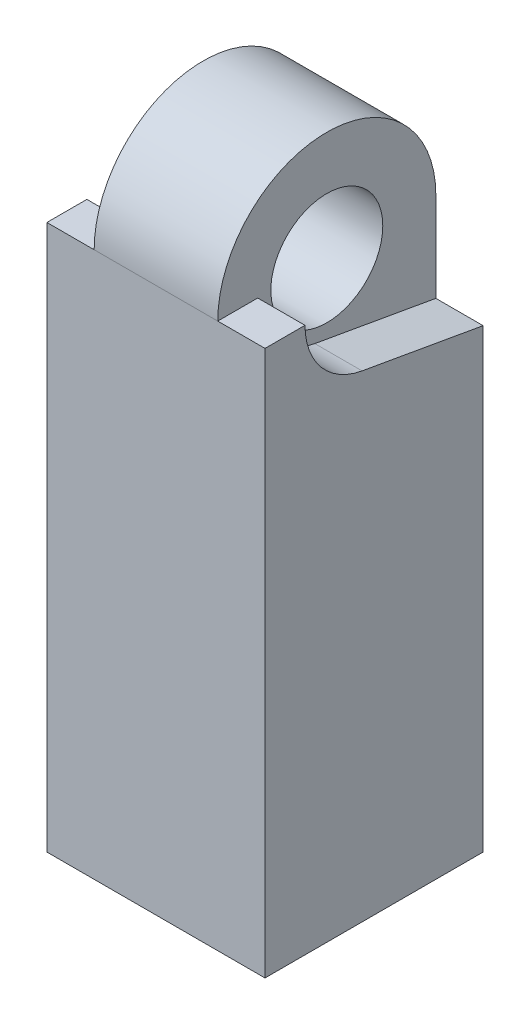
ISO-10303-21;
HEADER;
FILE_DESCRIPTION(('STEP AP214'),'2;1');
FILE_NAME('part.step','',(''),(''),'','','');
FILE_SCHEMA(('AUTOMOTIVE_DESIGN { 1 0 10303 214 1 1 1 1 }'));
ENDSEC;
DATA;
#1=APPLICATION_CONTEXT('core data for automotive mechanical design processes');
#2=APPLICATION_PROTOCOL_DEFINITION('international standard','automotive_design',2000,#1);
#3=PRODUCT_CONTEXT('',#1,'mechanical');
#4=PRODUCT('Part','Part','',(#3));
#5=PRODUCT_RELATED_PRODUCT_CATEGORY('part','',(#4));
#6=PRODUCT_DEFINITION_FORMATION('','',#4);
#7=PRODUCT_DEFINITION_CONTEXT('part definition',#1,'design');
#8=PRODUCT_DEFINITION('design','',#6,#7);
#9=PRODUCT_DEFINITION_SHAPE('','',#8);
#10=(LENGTH_UNIT() NAMED_UNIT(*) SI_UNIT(.MILLI.,.METRE.));
#11=(NAMED_UNIT(*) PLANE_ANGLE_UNIT() SI_UNIT($,.RADIAN.));
#12=(NAMED_UNIT(*) SI_UNIT($,.STERADIAN.) SOLID_ANGLE_UNIT());
#13=UNCERTAINTY_MEASURE_WITH_UNIT(LENGTH_MEASURE(1.E-05),#10,'distance_accuracy_value','');
#14=(GEOMETRIC_REPRESENTATION_CONTEXT(3) GLOBAL_UNCERTAINTY_ASSIGNED_CONTEXT((#13)) GLOBAL_UNIT_ASSIGNED_CONTEXT((#10,
#11,#12)) REPRESENTATION_CONTEXT('',''));
#15=CARTESIAN_POINT('',(0.,0.,0.));
#16=DIRECTION('',(0.,0.,1.));
#17=DIRECTION('',(1.,0.,0.));
#18=AXIS2_PLACEMENT_3D('',#15,#16,#17);
#19=CARTESIAN_POINT('',(-8.5,0.,0.));
#20=DIRECTION('',(1.,0.,0.));
#21=DIRECTION('',(0.,0.,-1.));
#22=AXIS2_PLACEMENT_3D('',#19,#20,#21);
#23=PLANE('',#22);
#24=CARTESIAN_POINT('',(-8.5,0.,0.));
#25=DIRECTION('',(1.,0.,0.));
#26=DIRECTION('',(0.,0.,-1.));
#27=AXIS2_PLACEMENT_3D('',#24,#25,#26);
#28=CIRCLE('',#27,7.7);
#29=CARTESIAN_POINT('',(-8.5,0.,-7.7));
#30=VERTEX_POINT('',#29);
#31=EDGE_CURVE('E195',#30,#30,#28,.T.);
#32=ORIENTED_EDGE('',*,*,#31,.T.);
#33=EDGE_LOOP('',(#32));
#34=FACE_BOUND('',#33,.T.);
#35=DIRECTION('',(0.,0.173648177666926,0.984807753012209));
#36=VECTOR('',#35,1.);
#37=CARTESIAN_POINT('',(-8.5,-9.35567365361599,1.6496576878358));
#38=LINE('',#37,#36);
#39=CARTESIAN_POINT('',(-8.5,-12.2914575235415,-15.));
#40=VERTEX_POINT('',#39);
#41=CARTESIAN_POINT('',(-8.5,-9.35567365361599,1.6496576878358));
#42=VERTEX_POINT('',#41);
#43=EDGE_CURVE('E200',#40,#42,#38,.T.);
#44=ORIENTED_EDGE('',*,*,#43,.T.);
#45=CARTESIAN_POINT('',(-8.5,0.,0.));
#46=DIRECTION('',(1.,0.,0.));
#47=DIRECTION('',(0.,0.,-1.));
#48=AXIS2_PLACEMENT_3D('',#45,#46,#47);
#49=CIRCLE('',#48,9.50000000000001);
#50=CARTESIAN_POINT('',(-8.5,0.,9.5));
#51=VERTEX_POINT('',#50);
#52=EDGE_CURVE('E191',#51,#42,#49,.T.);
#53=ORIENTED_EDGE('',*,*,#52,.F.);
#54=DIRECTION('',(0.,0.,-1.));
#55=VECTOR('',#54,1.);
#56=CARTESIAN_POINT('',(-8.5,0.,0.));
#57=LINE('',#56,#55);
#58=CARTESIAN_POINT('',(-8.5,0.,15.));
#59=VERTEX_POINT('',#58);
#60=EDGE_CURVE('E136',#59,#51,#57,.T.);
#61=ORIENTED_EDGE('',*,*,#60,.F.);
#62=CARTESIAN_POINT('',(-8.5,0.,0.));
#63=DIRECTION('',(1.,0.,0.));
#64=DIRECTION('',(0.,0.,-1.));
#65=AXIS2_PLACEMENT_3D('',#62,#63,#64);
#66=CIRCLE('',#65,15.);
#67=CARTESIAN_POINT('',(-8.5,0.,-15.));
#68=VERTEX_POINT('',#67);
#69=EDGE_CURVE('E198',#68,#59,#66,.T.);
#70=ORIENTED_EDGE('',*,*,#69,.F.);
#71=DIRECTION('',(0.,-1.,0.));
#72=VECTOR('',#71,1.);
#73=CARTESIAN_POINT('',(-8.5,0.,-15.));
#74=LINE('',#73,#72);
#75=EDGE_CURVE('E202',#68,#40,#74,.T.);
#76=ORIENTED_EDGE('',*,*,#75,.T.);
#77=EDGE_LOOP('',(#44,#53,#61,#70,#76));
#78=FACE_BOUND('',#77,.T.);
#79=ADVANCED_FACE('F41',(#34,#78),#23,.F.);
#80=CARTESIAN_POINT('',(8.5,0.,0.));
#81=DIRECTION('',(1.,0.,0.));
#82=DIRECTION('',(0.,0.,-1.));
#83=AXIS2_PLACEMENT_3D('',#80,#81,#82);
#84=PLANE('',#83);
#85=CARTESIAN_POINT('',(8.5,0.,0.));
#86=DIRECTION('',(1.,0.,0.));
#87=DIRECTION('',(0.,0.,-1.));
#88=AXIS2_PLACEMENT_3D('',#85,#86,#87);
#89=CIRCLE('',#88,7.7);
#90=CARTESIAN_POINT('',(8.5,0.,-7.7));
#91=VERTEX_POINT('',#90);
#92=EDGE_CURVE('E194',#91,#91,#89,.T.);
#93=ORIENTED_EDGE('',*,*,#92,.F.);
#94=EDGE_LOOP('',(#93));
#95=FACE_BOUND('',#94,.T.);
#96=CARTESIAN_POINT('',(8.5,0.,0.));
#97=DIRECTION('',(1.,0.,0.));
#98=DIRECTION('',(0.,0.,-1.));
#99=AXIS2_PLACEMENT_3D('',#96,#97,#98);
#100=CIRCLE('',#99,9.50000000000001);
#101=CARTESIAN_POINT('',(8.5,0.,9.5));
#102=VERTEX_POINT('',#101);
#103=CARTESIAN_POINT('',(8.5,-9.35567365361599,1.6496576878358));
#104=VERTEX_POINT('',#103);
#105=EDGE_CURVE('E11',#102,#104,#100,.T.);
#106=ORIENTED_EDGE('',*,*,#105,.T.);
#107=DIRECTION('',(0.,0.173648177666926,0.984807753012209));
#108=VECTOR('',#107,1.);
#109=CARTESIAN_POINT('',(8.5,-9.35567365361599,1.6496576878358));
#110=LINE('',#109,#108);
#111=CARTESIAN_POINT('',(8.5,-12.2914575235415,-15.));
#112=VERTEX_POINT('',#111);
#113=EDGE_CURVE('E210',#112,#104,#110,.T.);
#114=ORIENTED_EDGE('',*,*,#113,.F.);
#115=DIRECTION('',(0.,-1.,0.));
#116=VECTOR('',#115,1.);
#117=CARTESIAN_POINT('',(8.5,0.,-15.));
#118=LINE('',#117,#116);
#119=CARTESIAN_POINT('',(8.5,0.,-15.));
#120=VERTEX_POINT('',#119);
#121=EDGE_CURVE('E133',#120,#112,#118,.T.);
#122=ORIENTED_EDGE('',*,*,#121,.F.);
#123=CARTESIAN_POINT('',(8.5,0.,0.));
#124=DIRECTION('',(1.,0.,0.));
#125=DIRECTION('',(0.,0.,-1.));
#126=AXIS2_PLACEMENT_3D('',#123,#124,#125);
#127=CIRCLE('',#126,15.);
#128=CARTESIAN_POINT('',(8.5,0.,15.));
#129=VERTEX_POINT('',#128);
#130=EDGE_CURVE('E207',#120,#129,#127,.T.);
#131=ORIENTED_EDGE('',*,*,#130,.T.);
#132=DIRECTION('',(0.,0.,-1.));
#133=VECTOR('',#132,1.);
#134=CARTESIAN_POINT('',(8.5,0.,0.));
#135=LINE('',#134,#133);
#136=EDGE_CURVE('E49',#129,#102,#135,.T.);
#137=ORIENTED_EDGE('',*,*,#136,.T.);
#138=EDGE_LOOP('',(#106,#114,#122,#131,#137));
#139=FACE_BOUND('',#138,.T.);
#140=ADVANCED_FACE('F215',(#95,#139),#84,.T.);
#141=CARTESIAN_POINT('',(-8.5,0.,0.));
#142=DIRECTION('',(1.,0.,0.));
#143=DIRECTION('',(0.,0.,-1.));
#144=AXIS2_PLACEMENT_3D('',#141,#142,#143);
#145=CYLINDRICAL_SURFACE('',#144,15.);
#146=DIRECTION('',(-1.,0.,0.));
#147=VECTOR('',#146,1.);
#148=CARTESIAN_POINT('',(15.,0.,15.));
#149=LINE('',#148,#147);
#150=EDGE_CURVE('E186',#129,#59,#149,.T.);
#151=ORIENTED_EDGE('',*,*,#150,.F.);
#152=ORIENTED_EDGE('',*,*,#130,.F.);
#153=DIRECTION('',(1.,0.,0.));
#154=VECTOR('',#153,1.);
#155=CARTESIAN_POINT('',(-8.5,0.,-15.));
#156=LINE('',#155,#154);
#157=EDGE_CURVE('E65',#68,#120,#156,.T.);
#158=ORIENTED_EDGE('',*,*,#157,.F.);
#159=ORIENTED_EDGE('',*,*,#69,.T.);
#160=EDGE_LOOP('',(#151,#152,#158,#159));
#161=FACE_BOUND('',#160,.T.);
#162=ADVANCED_FACE('F225',(#161),#145,.T.);
#163=CARTESIAN_POINT('',(-8.5,0.,-15.));
#164=DIRECTION('',(0.,0.,1.));
#165=DIRECTION('',(0.,-1.,0.));
#166=AXIS2_PLACEMENT_3D('',#163,#164,#165);
#167=PLANE('',#166);
#168=ORIENTED_EDGE('',*,*,#121,.T.);
#169=DIRECTION('',(-1.,0.,0.));
#170=VECTOR('',#169,1.);
#171=CARTESIAN_POINT('',(15.,-12.2914575235415,-15.));
#172=LINE('',#171,#170);
#173=CARTESIAN_POINT('',(15.,-12.2914575235415,-15.));
#174=VERTEX_POINT('',#173);
#175=EDGE_CURVE('E126',#174,#112,#172,.T.);
#176=ORIENTED_EDGE('',*,*,#175,.F.);
#177=DIRECTION('',(0.,-1.,0.));
#178=VECTOR('',#177,1.);
#179=CARTESIAN_POINT('',(15.,0.,-15.));
#180=LINE('',#179,#178);
#181=CARTESIAN_POINT('',(15.,-75.,-15.));
#182=VERTEX_POINT('',#181);
#183=EDGE_CURVE('E130',#174,#182,#180,.T.);
#184=ORIENTED_EDGE('',*,*,#183,.T.);
#185=DIRECTION('',(-1.,0.,0.));
#186=VECTOR('',#185,1.);
#187=CARTESIAN_POINT('',(15.,-75.,-15.));
#188=LINE('',#187,#186);
#189=CARTESIAN_POINT('',(-15.,-75.,-15.));
#190=VERTEX_POINT('',#189);
#191=EDGE_CURVE('E163',#182,#190,#188,.T.);
#192=ORIENTED_EDGE('',*,*,#191,.T.);
#193=DIRECTION('',(0.,-1.,0.));
#194=VECTOR('',#193,1.);
#195=CARTESIAN_POINT('',(-15.,0.,-15.));
#196=LINE('',#195,#194);
#197=CARTESIAN_POINT('',(-15.,-12.2914575235415,-15.));
#198=VERTEX_POINT('',#197);
#199=EDGE_CURVE('E164',#198,#190,#196,.T.);
#200=ORIENTED_EDGE('',*,*,#199,.F.);
#201=EDGE_CURVE('E137',#40,#198,#172,.T.);
#202=ORIENTED_EDGE('',*,*,#201,.F.);
#203=ORIENTED_EDGE('',*,*,#75,.F.);
#204=ORIENTED_EDGE('',*,*,#157,.T.);
#205=EDGE_LOOP('',(#168,#176,#184,#192,#200,#202,#203,#204));
#206=FACE_BOUND('',#205,.T.);
#207=ADVANCED_FACE('F128',(#206),#167,.F.);
#208=CARTESIAN_POINT('',(-8.5,0.,0.));
#209=DIRECTION('',(1.,0.,0.));
#210=DIRECTION('',(0.,0.,-1.));
#211=AXIS2_PLACEMENT_3D('',#208,#209,#210);
#212=CYLINDRICAL_SURFACE('',#211,7.7);
#213=ORIENTED_EDGE('',*,*,#31,.F.);
#214=EDGE_LOOP('',(#213));
#215=FACE_BOUND('',#214,.T.);
#216=ORIENTED_EDGE('',*,*,#92,.T.);
#217=EDGE_LOOP('',(#216));
#218=FACE_BOUND('',#217,.T.);
#219=ADVANCED_FACE('F43',(#215,#218),#212,.F.);
#220=CARTESIAN_POINT('',(15.,-9.35567365361599,1.6496576878358));
#221=DIRECTION('',(0.,-0.984807753012209,0.173648177666926));
#222=DIRECTION('',(0.,-0.173648177666926,-0.984807753012209));
#223=AXIS2_PLACEMENT_3D('',#220,#221,#222);
#224=PLANE('',#223);
#225=DIRECTION('',(-1.,0.,0.));
#226=VECTOR('',#225,1.);
#227=CARTESIAN_POINT('',(15.,-9.35567365361599,1.6496576878358));
#228=LINE('',#227,#226);
#229=CARTESIAN_POINT('',(-15.,-9.35567365361599,1.6496576878358));
#230=VERTEX_POINT('',#229);
#231=EDGE_CURVE('E188',#42,#230,#228,.T.);
#232=ORIENTED_EDGE('',*,*,#231,.F.);
#233=ORIENTED_EDGE('',*,*,#43,.F.);
#234=ORIENTED_EDGE('',*,*,#201,.T.);
#235=DIRECTION('',(0.,0.173648177666926,0.984807753012209));
#236=VECTOR('',#235,1.);
#237=CARTESIAN_POINT('',(-15.,-9.35567365361599,1.6496576878358));
#238=LINE('',#237,#236);
#239=EDGE_CURVE('E167',#198,#230,#238,.T.);
#240=ORIENTED_EDGE('',*,*,#239,.T.);
#241=EDGE_LOOP('',(#232,#233,#234,#240));
#242=FACE_BOUND('',#241,.T.);
#243=ADVANCED_FACE('F247',(#242),#224,.F.);
#244=CARTESIAN_POINT('',(15.,0.,0.));
#245=DIRECTION('',(-1.,0.,0.));
#246=DIRECTION('',(0.,0.,1.));
#247=AXIS2_PLACEMENT_3D('',#244,#245,#246);
#248=CYLINDRICAL_SURFACE('',#247,9.50000000000001);
#249=DIRECTION('',(-1.,0.,0.));
#250=VECTOR('',#249,1.);
#251=CARTESIAN_POINT('',(15.,0.,9.5));
#252=LINE('',#251,#250);
#253=CARTESIAN_POINT('',(-15.,0.,9.5));
#254=VERTEX_POINT('',#253);
#255=EDGE_CURVE('E185',#51,#254,#252,.T.);
#256=ORIENTED_EDGE('',*,*,#255,.F.);
#257=ORIENTED_EDGE('',*,*,#52,.T.);
#258=ORIENTED_EDGE('',*,*,#231,.T.);
#259=CARTESIAN_POINT('',(-15.,0.,0.));
#260=DIRECTION('',(1.,0.,0.));
#261=DIRECTION('',(0.,0.,-1.));
#262=AXIS2_PLACEMENT_3D('',#259,#260,#261);
#263=CIRCLE('',#262,9.50000000000001);
#264=EDGE_CURVE('E170',#230,#254,#263,.F.);
#265=ORIENTED_EDGE('',*,*,#264,.T.);
#266=EDGE_LOOP('',(#256,#257,#258,#265));
#267=FACE_BOUND('',#266,.T.);
#268=ADVANCED_FACE('F245',(#267),#248,.F.);
#269=CARTESIAN_POINT('',(15.,0.,0.));
#270=DIRECTION('',(0.,-1.,0.));
#271=DIRECTION('',(0.,0.,-1.));
#272=AXIS2_PLACEMENT_3D('',#269,#270,#271);
#273=PLANE('',#272);
#274=CARTESIAN_POINT('',(-15.,0.,15.));
#275=VERTEX_POINT('',#274);
#276=EDGE_CURVE('E181',#59,#275,#149,.T.);
#277=ORIENTED_EDGE('',*,*,#276,.F.);
#278=ORIENTED_EDGE('',*,*,#60,.T.);
#279=ORIENTED_EDGE('',*,*,#255,.T.);
#280=DIRECTION('',(0.,0.,1.));
#281=VECTOR('',#280,1.);
#282=CARTESIAN_POINT('',(-15.,0.,0.));
#283=LINE('',#282,#281);
#284=EDGE_CURVE('E173',#254,#275,#283,.T.);
#285=ORIENTED_EDGE('',*,*,#284,.T.);
#286=EDGE_LOOP('',(#277,#278,#279,#285));
#287=FACE_BOUND('',#286,.T.);
#288=ADVANCED_FACE('F230',(#287),#273,.F.);
#289=ORIENTED_EDGE('',*,*,#113,.T.);
#290=CARTESIAN_POINT('',(15.,-9.35567365361599,1.6496576878358));
#291=VERTEX_POINT('',#290);
#292=EDGE_CURVE('E143',#291,#104,#228,.T.);
#293=ORIENTED_EDGE('',*,*,#292,.F.);
#294=DIRECTION('',(0.,0.173648177666926,0.984807753012209));
#295=VECTOR('',#294,1.);
#296=CARTESIAN_POINT('',(15.,-9.35567365361599,1.6496576878358));
#297=LINE('',#296,#295);
#298=EDGE_CURVE('E140',#174,#291,#297,.T.);
#299=ORIENTED_EDGE('',*,*,#298,.F.);
#300=ORIENTED_EDGE('',*,*,#175,.T.);
#301=EDGE_LOOP('',(#289,#293,#299,#300));
#302=FACE_BOUND('',#301,.T.);
#303=ADVANCED_FACE('F141',(#302),#224,.F.);
#304=ORIENTED_EDGE('',*,*,#105,.F.);
#305=CARTESIAN_POINT('',(15.,0.,9.5));
#306=VERTEX_POINT('',#305);
#307=EDGE_CURVE('E56',#306,#102,#252,.T.);
#308=ORIENTED_EDGE('',*,*,#307,.F.);
#309=CARTESIAN_POINT('',(15.,0.,0.));
#310=DIRECTION('',(1.,0.,0.));
#311=DIRECTION('',(0.,0.,-1.));
#312=AXIS2_PLACEMENT_3D('',#309,#310,#311);
#313=CIRCLE('',#312,9.50000000000001);
#314=EDGE_CURVE('E146',#291,#306,#313,.F.);
#315=ORIENTED_EDGE('',*,*,#314,.F.);
#316=ORIENTED_EDGE('',*,*,#292,.T.);
#317=EDGE_LOOP('',(#304,#308,#315,#316));
#318=FACE_BOUND('',#317,.T.);
#319=ADVANCED_FACE('F255',(#318),#248,.F.);
#320=ORIENTED_EDGE('',*,*,#136,.F.);
#321=CARTESIAN_POINT('',(15.,0.,15.));
#322=VERTEX_POINT('',#321);
#323=EDGE_CURVE('E182',#322,#129,#149,.T.);
#324=ORIENTED_EDGE('',*,*,#323,.F.);
#325=DIRECTION('',(0.,0.,1.));
#326=VECTOR('',#325,1.);
#327=CARTESIAN_POINT('',(15.,0.,0.));
#328=LINE('',#327,#326);
#329=EDGE_CURVE('E158',#306,#322,#328,.T.);
#330=ORIENTED_EDGE('',*,*,#329,.F.);
#331=ORIENTED_EDGE('',*,*,#307,.T.);
#332=EDGE_LOOP('',(#320,#324,#330,#331));
#333=FACE_BOUND('',#332,.T.);
#334=ADVANCED_FACE('F217',(#333),#273,.F.);
#335=CARTESIAN_POINT('',(15.,0.,15.));
#336=DIRECTION('',(0.,0.,-1.));
#337=DIRECTION('',(0.,1.,0.));
#338=AXIS2_PLACEMENT_3D('',#335,#336,#337);
#339=PLANE('',#338);
#340=DIRECTION('',(0.,-1.,0.));
#341=VECTOR('',#340,1.);
#342=CARTESIAN_POINT('',(-15.,0.,15.));
#343=LINE('',#342,#341);
#344=CARTESIAN_POINT('',(-15.,-75.,15.));
#345=VERTEX_POINT('',#344);
#346=EDGE_CURVE('E154',#275,#345,#343,.T.);
#347=ORIENTED_EDGE('',*,*,#346,.T.);
#348=DIRECTION('',(-1.,0.,0.));
#349=VECTOR('',#348,1.);
#350=CARTESIAN_POINT('',(15.,-75.,15.));
#351=LINE('',#350,#349);
#352=CARTESIAN_POINT('',(15.,-75.,15.));
#353=VERTEX_POINT('',#352);
#354=EDGE_CURVE('E179',#353,#345,#351,.T.);
#355=ORIENTED_EDGE('',*,*,#354,.F.);
#356=DIRECTION('',(0.,-1.,0.));
#357=VECTOR('',#356,1.);
#358=CARTESIAN_POINT('',(15.,0.,15.));
#359=LINE('',#358,#357);
#360=EDGE_CURVE('E160',#322,#353,#359,.T.);
#361=ORIENTED_EDGE('',*,*,#360,.F.);
#362=ORIENTED_EDGE('',*,*,#323,.T.);
#363=ORIENTED_EDGE('',*,*,#150,.T.);
#364=ORIENTED_EDGE('',*,*,#276,.T.);
#365=EDGE_LOOP('',(#347,#355,#361,#362,#363,#364));
#366=FACE_BOUND('',#365,.T.);
#367=ADVANCED_FACE('F222',(#366),#339,.F.);
#368=CARTESIAN_POINT('',(15.,-75.,0.));
#369=DIRECTION('',(0.,-1.,0.));
#370=DIRECTION('',(0.,0.,-1.));
#371=AXIS2_PLACEMENT_3D('',#368,#369,#370);
#372=PLANE('',#371);
#373=DIRECTION('',(0.,0.,1.));
#374=VECTOR('',#373,1.);
#375=CARTESIAN_POINT('',(-15.,-75.,0.));
#376=LINE('',#375,#374);
#377=EDGE_CURVE('E151',#190,#345,#376,.T.);
#378=ORIENTED_EDGE('',*,*,#377,.F.);
#379=ORIENTED_EDGE('',*,*,#191,.F.);
#380=DIRECTION('',(0.,0.,1.));
#381=VECTOR('',#380,1.);
#382=CARTESIAN_POINT('',(15.,-75.,0.));
#383=LINE('',#382,#381);
#384=EDGE_CURVE('E150',#182,#353,#383,.T.);
#385=ORIENTED_EDGE('',*,*,#384,.T.);
#386=ORIENTED_EDGE('',*,*,#354,.T.);
#387=EDGE_LOOP('',(#378,#379,#385,#386));
#388=FACE_BOUND('',#387,.T.);
#389=ADVANCED_FACE('F239',(#388),#372,.T.);
#390=CARTESIAN_POINT('',(15.,0.,0.));
#391=DIRECTION('',(1.,0.,0.));
#392=DIRECTION('',(0.,0.,-1.));
#393=AXIS2_PLACEMENT_3D('',#390,#391,#392);
#394=PLANE('',#393);
#395=ORIENTED_EDGE('',*,*,#183,.F.);
#396=ORIENTED_EDGE('',*,*,#298,.T.);
#397=ORIENTED_EDGE('',*,*,#314,.T.);
#398=ORIENTED_EDGE('',*,*,#329,.T.);
#399=ORIENTED_EDGE('',*,*,#360,.T.);
#400=ORIENTED_EDGE('',*,*,#384,.F.);
#401=EDGE_LOOP('',(#395,#396,#397,#398,#399,#400));
#402=FACE_BOUND('',#401,.T.);
#403=ADVANCED_FACE('F148',(#402),#394,.T.);
#404=CARTESIAN_POINT('',(-15.,0.,0.));
#405=DIRECTION('',(1.,0.,0.));
#406=DIRECTION('',(0.,0.,-1.));
#407=AXIS2_PLACEMENT_3D('',#404,#405,#406);
#408=PLANE('',#407);
#409=ORIENTED_EDGE('',*,*,#199,.T.);
#410=ORIENTED_EDGE('',*,*,#377,.T.);
#411=ORIENTED_EDGE('',*,*,#346,.F.);
#412=ORIENTED_EDGE('',*,*,#284,.F.);
#413=ORIENTED_EDGE('',*,*,#264,.F.);
#414=ORIENTED_EDGE('',*,*,#239,.F.);
#415=EDGE_LOOP('',(#409,#410,#411,#412,#413,#414));
#416=FACE_BOUND('',#415,.T.);
#417=ADVANCED_FACE('F234',(#416),#408,.F.);
#418=CLOSED_SHELL('',(#79,#140,#162,#207,#219,#243,#268,#288,#303,#319,#334,#367,#389,#403,#417));
#419=MANIFOLD_SOLID_BREP('B2',#418);
#420=ADVANCED_BREP_SHAPE_REPRESENTATION('',(#18,#419),#14);
#421=SHAPE_DEFINITION_REPRESENTATION(#9,#420);
ENDSEC;
END-ISO-10303-21;
